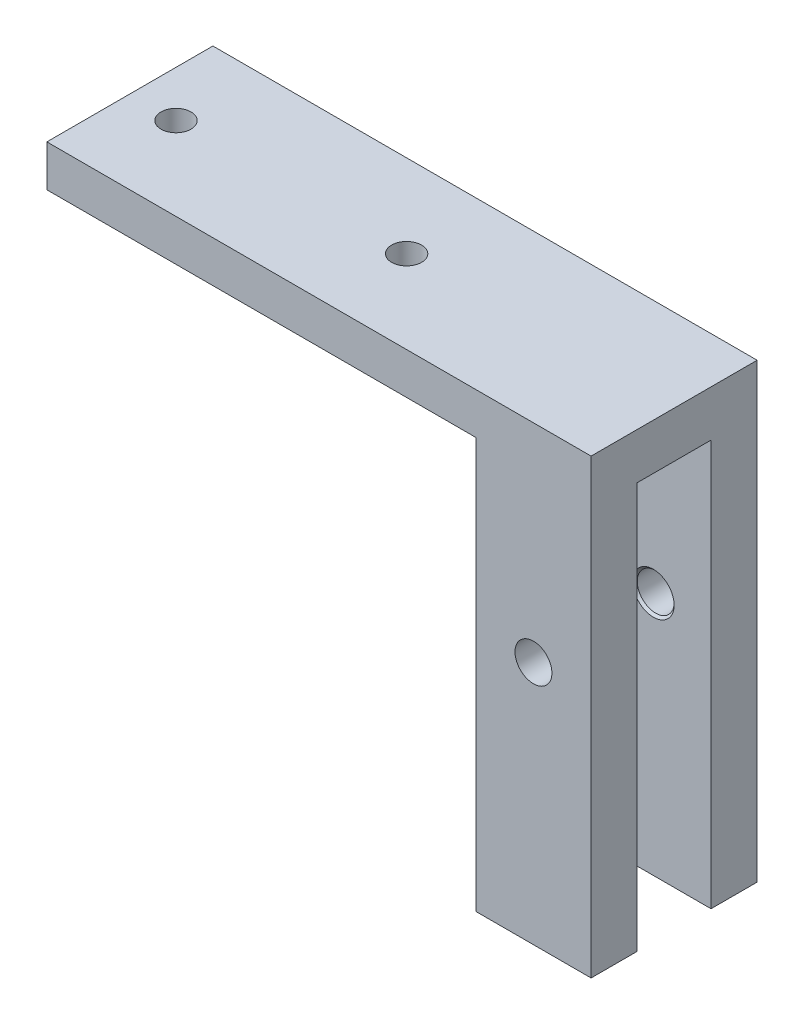
ISO-10303-21;
HEADER;
FILE_DESCRIPTION(('STEP AP214'),'2;1');
FILE_NAME('part.step','',(''),(''),'','','');
FILE_SCHEMA(('AUTOMOTIVE_DESIGN { 1 0 10303 214 1 1 1 1 }'));
ENDSEC;
DATA;
#1=APPLICATION_CONTEXT('core data for automotive mechanical design processes');
#2=APPLICATION_PROTOCOL_DEFINITION('international standard','automotive_design',2000,#1);
#3=PRODUCT_CONTEXT('',#1,'mechanical');
#4=PRODUCT('Part','Part','',(#3));
#5=PRODUCT_RELATED_PRODUCT_CATEGORY('part','',(#4));
#6=PRODUCT_DEFINITION_FORMATION('','',#4);
#7=PRODUCT_DEFINITION_CONTEXT('part definition',#1,'design');
#8=PRODUCT_DEFINITION('design','',#6,#7);
#9=PRODUCT_DEFINITION_SHAPE('','',#8);
#10=(LENGTH_UNIT() NAMED_UNIT(*) SI_UNIT(.MILLI.,.METRE.));
#11=(NAMED_UNIT(*) PLANE_ANGLE_UNIT() SI_UNIT($,.RADIAN.));
#12=(NAMED_UNIT(*) SI_UNIT($,.STERADIAN.) SOLID_ANGLE_UNIT());
#13=UNCERTAINTY_MEASURE_WITH_UNIT(LENGTH_MEASURE(1.E-05),#10,'distance_accuracy_value','');
#14=(GEOMETRIC_REPRESENTATION_CONTEXT(3) GLOBAL_UNCERTAINTY_ASSIGNED_CONTEXT((#13)) GLOBAL_UNIT_ASSIGNED_CONTEXT((#10,
#11,#12)) REPRESENTATION_CONTEXT('',''));
#15=CARTESIAN_POINT('',(0.,0.,0.));
#16=DIRECTION('',(0.,0.,1.));
#17=DIRECTION('',(1.,0.,0.));
#18=AXIS2_PLACEMENT_3D('',#15,#16,#17);
#19=CARTESIAN_POINT('',(0.,-78.,0.));
#20=DIRECTION('',(0.,-1.,0.));
#21=DIRECTION('',(0.,0.,-1.));
#22=AXIS2_PLACEMENT_3D('',#19,#20,#21);
#23=PLANE('',#22);
#24=DIRECTION('',(0.,0.,-1.));
#25=VECTOR('',#24,1.);
#26=CARTESIAN_POINT('',(30.,-78.,-7.));
#27=LINE('',#26,#25);
#28=CARTESIAN_POINT('',(30.,-78.,-5.));
#29=VERTEX_POINT('',#28);
#30=CARTESIAN_POINT('',(30.,-78.,-15.));
#31=VERTEX_POINT('',#30);
#32=EDGE_CURVE('E229',#29,#31,#27,.T.);
#33=ORIENTED_EDGE('',*,*,#32,.T.);
#34=DIRECTION('',(1.,0.,0.));
#35=VECTOR('',#34,1.);
#36=CARTESIAN_POINT('',(30.,-78.,-15.));
#37=LINE('',#36,#35);
#38=CARTESIAN_POINT('',(55.,-78.,-15.));
#39=VERTEX_POINT('',#38);
#40=EDGE_CURVE('E182',#31,#39,#37,.T.);
#41=ORIENTED_EDGE('',*,*,#40,.T.);
#42=DIRECTION('',(0.,0.,1.));
#43=VECTOR('',#42,1.);
#44=CARTESIAN_POINT('',(55.,-78.,0.));
#45=LINE('',#44,#43);
#46=CARTESIAN_POINT('',(55.,-78.,-5.));
#47=VERTEX_POINT('',#46);
#48=EDGE_CURVE('E130',#39,#47,#45,.T.);
#49=ORIENTED_EDGE('',*,*,#48,.T.);
#50=DIRECTION('',(-1.,0.,0.));
#51=VECTOR('',#50,1.);
#52=CARTESIAN_POINT('',(45.,-78.,-5.));
#53=LINE('',#52,#51);
#54=EDGE_CURVE('E113',#47,#29,#53,.T.);
#55=ORIENTED_EDGE('',*,*,#54,.T.);
#56=EDGE_LOOP('',(#33,#41,#49,#55));
#57=FACE_BOUND('',#56,.T.);
#58=ADVANCED_FACE('F18',(#57),#23,.T.);
#59=CARTESIAN_POINT('',(0.,20.,0.));
#60=DIRECTION('',(0.,-1.,0.));
#61=DIRECTION('',(0.,0.,-1.));
#62=AXIS2_PLACEMENT_3D('',#59,#60,#61);
#63=PLANE('',#62);
#64=CARTESIAN_POINT('',(-53.,20.,3.));
#65=DIRECTION('',(0.,-1.,0.));
#66=DIRECTION('',(0.,0.,-1.));
#67=AXIS2_PLACEMENT_3D('',#64,#65,#66);
#68=CIRCLE('',#67,3.25);
#69=CARTESIAN_POINT('',(-53.,20.,-0.25));
#70=VERTEX_POINT('',#69);
#71=EDGE_CURVE('E126',#70,#70,#68,.F.);
#72=ORIENTED_EDGE('',*,*,#71,.F.);
#73=EDGE_LOOP('',(#72));
#74=FACE_BOUND('',#73,.T.);
#75=CARTESIAN_POINT('',(-3.,20.,3.));
#76=DIRECTION('',(0.,-1.,0.));
#77=DIRECTION('',(0.,0.,-1.));
#78=AXIS2_PLACEMENT_3D('',#75,#76,#77);
#79=CIRCLE('',#78,3.25);
#80=CARTESIAN_POINT('',(-3.,20.,-0.25));
#81=VERTEX_POINT('',#80);
#82=EDGE_CURVE('E192',#81,#81,#79,.F.);
#83=ORIENTED_EDGE('',*,*,#82,.F.);
#84=EDGE_LOOP('',(#83));
#85=FACE_BOUND('',#84,.T.);
#86=DIRECTION('',(0.,0.,1.));
#87=VECTOR('',#86,1.);
#88=CARTESIAN_POINT('',(55.,20.,0.));
#89=LINE('',#88,#87);
#90=CARTESIAN_POINT('',(55.,20.,-15.));
#91=VERTEX_POINT('',#90);
#92=CARTESIAN_POINT('',(55.,20.,21.));
#93=VERTEX_POINT('',#92);
#94=EDGE_CURVE('E105',#91,#93,#89,.T.);
#95=ORIENTED_EDGE('',*,*,#94,.F.);
#96=DIRECTION('',(1.,0.,0.));
#97=VECTOR('',#96,1.);
#98=CARTESIAN_POINT('',(-25.,20.,-15.));
#99=LINE('',#98,#97);
#100=CARTESIAN_POINT('',(-63.,20.,-15.));
#101=VERTEX_POINT('',#100);
#102=EDGE_CURVE('E109',#101,#91,#99,.T.);
#103=ORIENTED_EDGE('',*,*,#102,.F.);
#104=DIRECTION('',(0.,0.,-1.));
#105=VECTOR('',#104,1.);
#106=CARTESIAN_POINT('',(-63.,20.,15.));
#107=LINE('',#106,#105);
#108=CARTESIAN_POINT('',(-63.,20.,21.));
#109=VERTEX_POINT('',#108);
#110=EDGE_CURVE('E162',#109,#101,#107,.T.);
#111=ORIENTED_EDGE('',*,*,#110,.F.);
#112=DIRECTION('',(-1.,0.,0.));
#113=VECTOR('',#112,1.);
#114=CARTESIAN_POINT('',(25.,20.,21.));
#115=LINE('',#114,#113);
#116=EDGE_CURVE('E111',#93,#109,#115,.T.);
#117=ORIENTED_EDGE('',*,*,#116,.F.);
#118=EDGE_LOOP('',(#95,#103,#111,#117));
#119=FACE_BOUND('',#118,.T.);
#120=ADVANCED_FACE('F107',(#74,#85,#119),#63,.F.);
#121=CARTESIAN_POINT('',(0.,10.,0.));
#122=DIRECTION('',(0.,-1.,0.));
#123=DIRECTION('',(0.,0.,-1.));
#124=AXIS2_PLACEMENT_3D('',#121,#122,#123);
#125=PLANE('',#124);
#126=CARTESIAN_POINT('',(-3.,10.,3.));
#127=DIRECTION('',(0.,1.,0.));
#128=DIRECTION('',(1.,0.,0.));
#129=AXIS2_PLACEMENT_3D('',#126,#127,#128);
#130=CIRCLE('',#129,3.25);
#131=CARTESIAN_POINT('',(0.25,10.,3.));
#132=VERTEX_POINT('',#131);
#133=EDGE_CURVE('E149',#132,#132,#130,.T.);
#134=ORIENTED_EDGE('',*,*,#133,.T.);
#135=EDGE_LOOP('',(#134));
#136=FACE_BOUND('',#135,.T.);
#137=CARTESIAN_POINT('',(-53.,10.,3.));
#138=DIRECTION('',(0.,1.,0.));
#139=DIRECTION('',(1.,0.,0.));
#140=AXIS2_PLACEMENT_3D('',#137,#138,#139);
#141=CIRCLE('',#140,3.25);
#142=CARTESIAN_POINT('',(-49.75,10.,3.));
#143=VERTEX_POINT('',#142);
#144=EDGE_CURVE('E143',#143,#143,#141,.T.);
#145=ORIENTED_EDGE('',*,*,#144,.T.);
#146=EDGE_LOOP('',(#145));
#147=FACE_BOUND('',#146,.T.);
#148=DIRECTION('',(0.,0.,-1.));
#149=VECTOR('',#148,1.);
#150=CARTESIAN_POINT('',(-62.,10.,0.));
#151=LINE('',#150,#149);
#152=CARTESIAN_POINT('',(-62.,10.,20.));
#153=VERTEX_POINT('',#152);
#154=CARTESIAN_POINT('',(-62.,10.,-14.));
#155=VERTEX_POINT('',#154);
#156=EDGE_CURVE('E164',#153,#155,#151,.T.);
#157=ORIENTED_EDGE('',*,*,#156,.T.);
#158=DIRECTION('',(1.,0.,0.));
#159=VECTOR('',#158,1.);
#160=CARTESIAN_POINT('',(0.,10.,-14.));
#161=LINE('',#160,#159);
#162=CARTESIAN_POINT('',(30.,10.,-14.));
#163=VERTEX_POINT('',#162);
#164=EDGE_CURVE('E166',#155,#163,#161,.T.);
#165=ORIENTED_EDGE('',*,*,#164,.T.);
#166=DIRECTION('',(0.,0.,1.));
#167=VECTOR('',#166,1.);
#168=CARTESIAN_POINT('',(30.,10.,-7.5));
#169=LINE('',#168,#167);
#170=CARTESIAN_POINT('',(30.,10.,-5.));
#171=VERTEX_POINT('',#170);
#172=EDGE_CURVE('E137',#163,#171,#169,.T.);
#173=ORIENTED_EDGE('',*,*,#172,.T.);
#174=DIRECTION('',(-1.,0.,0.));
#175=VECTOR('',#174,1.);
#176=CARTESIAN_POINT('',(20.,10.,-5.));
#177=LINE('',#176,#175);
#178=CARTESIAN_POINT('',(55.,10.,-5.));
#179=VERTEX_POINT('',#178);
#180=EDGE_CURVE('E155',#171,#179,#177,.F.);
#181=ORIENTED_EDGE('',*,*,#180,.T.);
#182=DIRECTION('',(0.,0.,1.));
#183=VECTOR('',#182,1.);
#184=CARTESIAN_POINT('',(55.,10.,5.));
#185=LINE('',#184,#183);
#186=CARTESIAN_POINT('',(55.,10.,11.));
#187=VERTEX_POINT('',#186);
#188=EDGE_CURVE('E151',#179,#187,#185,.T.);
#189=ORIENTED_EDGE('',*,*,#188,.T.);
#190=DIRECTION('',(1.,0.,0.));
#191=VECTOR('',#190,1.);
#192=CARTESIAN_POINT('',(30.,10.,11.));
#193=LINE('',#192,#191);
#194=CARTESIAN_POINT('',(30.,10.,11.));
#195=VERTEX_POINT('',#194);
#196=EDGE_CURVE('E114',#187,#195,#193,.F.);
#197=ORIENTED_EDGE('',*,*,#196,.T.);
#198=DIRECTION('',(0.,0.,1.));
#199=VECTOR('',#198,1.);
#200=CARTESIAN_POINT('',(30.,10.,15.));
#201=LINE('',#200,#199);
#202=CARTESIAN_POINT('',(30.,10.,20.));
#203=VERTEX_POINT('',#202);
#204=EDGE_CURVE('E139',#195,#203,#201,.T.);
#205=ORIENTED_EDGE('',*,*,#204,.T.);
#206=DIRECTION('',(1.,0.,0.));
#207=VECTOR('',#206,1.);
#208=CARTESIAN_POINT('',(0.,10.,20.));
#209=LINE('',#208,#207);
#210=EDGE_CURVE('E167',#203,#153,#209,.F.);
#211=ORIENTED_EDGE('',*,*,#210,.T.);
#212=EDGE_LOOP('',(#157,#165,#173,#181,#189,#197,#205,#211));
#213=FACE_BOUND('',#212,.T.);
#214=ADVANCED_FACE('F253',(#136,#147,#213),#125,.T.);
#215=CARTESIAN_POINT('',(30.,-30.,-7.5));
#216=DIRECTION('',(1.,0.,0.));
#217=DIRECTION('',(0.,0.,-1.));
#218=AXIS2_PLACEMENT_3D('',#215,#216,#217);
#219=PLANE('',#218);
#220=DIRECTION('',(0.,1.,0.));
#221=VECTOR('',#220,1.);
#222=CARTESIAN_POINT('',(30.,-30.,-15.));
#223=LINE('',#222,#221);
#224=CARTESIAN_POINT('',(30.,11.,-15.));
#225=VERTEX_POINT('',#224);
#226=EDGE_CURVE('E144',#31,#225,#223,.T.);
#227=ORIENTED_EDGE('',*,*,#226,.F.);
#228=ORIENTED_EDGE('',*,*,#32,.F.);
#229=DIRECTION('',(0.,1.,0.));
#230=VECTOR('',#229,1.);
#231=CARTESIAN_POINT('',(30.,-30.,-5.));
#232=LINE('',#231,#230);
#233=EDGE_CURVE('E146',#29,#171,#232,.T.);
#234=ORIENTED_EDGE('',*,*,#233,.T.);
#235=ORIENTED_EDGE('',*,*,#172,.F.);
#236=DIRECTION('',(0.,-0.707106781186547,0.707106781186548));
#237=VECTOR('',#236,1.);
#238=CARTESIAN_POINT('',(30.,-13.25,9.25));
#239=LINE('',#238,#237);
#240=EDGE_CURVE('E175',#163,#225,#239,.F.);
#241=ORIENTED_EDGE('',*,*,#240,.T.);
#242=EDGE_LOOP('',(#227,#228,#234,#235,#241));
#243=FACE_BOUND('',#242,.T.);
#244=ADVANCED_FACE('F262',(#243),#219,.F.);
#245=CARTESIAN_POINT('',(25.,10.,21.));
#246=DIRECTION('',(0.,0.,1.));
#247=DIRECTION('',(1.,0.,0.));
#248=AXIS2_PLACEMENT_3D('',#245,#246,#247);
#249=PLANE('',#248);
#250=DIRECTION('',(0.,-1.,0.));
#251=VECTOR('',#250,1.);
#252=CARTESIAN_POINT('',(-63.,10.,21.));
#253=LINE('',#252,#251);
#254=CARTESIAN_POINT('',(-63.,11.,21.));
#255=VERTEX_POINT('',#254);
#256=EDGE_CURVE('E161',#109,#255,#253,.T.);
#257=ORIENTED_EDGE('',*,*,#256,.T.);
#258=DIRECTION('',(-1.,0.,0.));
#259=VECTOR('',#258,1.);
#260=CARTESIAN_POINT('',(25.,11.,21.));
#261=LINE('',#260,#259);
#262=CARTESIAN_POINT('',(30.,11.,21.));
#263=VERTEX_POINT('',#262);
#264=EDGE_CURVE('E174',#255,#263,#261,.F.);
#265=ORIENTED_EDGE('',*,*,#264,.T.);
#266=DIRECTION('',(0.,1.,0.));
#267=VECTOR('',#266,1.);
#268=CARTESIAN_POINT('',(30.,-30.,21.));
#269=LINE('',#268,#267);
#270=CARTESIAN_POINT('',(30.,-78.,21.));
#271=VERTEX_POINT('',#270);
#272=EDGE_CURVE('E190',#271,#263,#269,.T.);
#273=ORIENTED_EDGE('',*,*,#272,.F.);
#274=DIRECTION('',(-1.,0.,0.));
#275=VECTOR('',#274,1.);
#276=CARTESIAN_POINT('',(55.,-78.,21.));
#277=LINE('',#276,#275);
#278=CARTESIAN_POINT('',(55.,-78.,21.));
#279=VERTEX_POINT('',#278);
#280=EDGE_CURVE('E225',#279,#271,#277,.T.);
#281=ORIENTED_EDGE('',*,*,#280,.F.);
#282=DIRECTION('',(0.,1.,0.));
#283=VECTOR('',#282,1.);
#284=CARTESIAN_POINT('',(55.,-6.5,21.));
#285=LINE('',#284,#283);
#286=EDGE_CURVE('E134',#279,#93,#285,.T.);
#287=ORIENTED_EDGE('',*,*,#286,.T.);
#288=ORIENTED_EDGE('',*,*,#116,.T.);
#289=EDGE_LOOP('',(#257,#265,#273,#281,#287,#288));
#290=FACE_BOUND('',#289,.T.);
#291=CARTESIAN_POINT('',(42.5,-25.,21.));
#292=DIRECTION('',(0.,0.,1.));
#293=DIRECTION('',(1.,0.,0.));
#294=AXIS2_PLACEMENT_3D('',#291,#292,#293);
#295=CIRCLE('',#294,4.);
#296=CARTESIAN_POINT('',(46.5,-25.,21.));
#297=VERTEX_POINT('',#296);
#298=EDGE_CURVE('E199',#297,#297,#295,.F.);
#299=ORIENTED_EDGE('',*,*,#298,.T.);
#300=EDGE_LOOP('',(#299));
#301=FACE_BOUND('',#300,.T.);
#302=ADVANCED_FACE('F239',(#290,#301),#249,.T.);
#303=CARTESIAN_POINT('',(30.,-30.,15.));
#304=DIRECTION('',(1.,0.,0.));
#305=DIRECTION('',(0.,0.,-1.));
#306=AXIS2_PLACEMENT_3D('',#303,#304,#305);
#307=PLANE('',#306);
#308=DIRECTION('',(0.,0.,-1.));
#309=VECTOR('',#308,1.);
#310=CARTESIAN_POINT('',(30.,-78.,15.));
#311=LINE('',#310,#309);
#312=CARTESIAN_POINT('',(30.,-78.,11.));
#313=VERTEX_POINT('',#312);
#314=EDGE_CURVE('E22',#271,#313,#311,.T.);
#315=ORIENTED_EDGE('',*,*,#314,.F.);
#316=ORIENTED_EDGE('',*,*,#272,.T.);
#317=DIRECTION('',(0.,0.707106781186547,0.707106781186548));
#318=VECTOR('',#317,1.);
#319=CARTESIAN_POINT('',(30.,-12.5,-2.5));
#320=LINE('',#319,#318);
#321=EDGE_CURVE('E178',#263,#203,#320,.F.);
#322=ORIENTED_EDGE('',*,*,#321,.T.);
#323=ORIENTED_EDGE('',*,*,#204,.F.);
#324=DIRECTION('',(0.,1.,0.));
#325=VECTOR('',#324,1.);
#326=CARTESIAN_POINT('',(30.,-30.,11.));
#327=LINE('',#326,#325);
#328=EDGE_CURVE('E145',#313,#195,#327,.T.);
#329=ORIENTED_EDGE('',*,*,#328,.F.);
#330=EDGE_LOOP('',(#315,#316,#322,#323,#329));
#331=FACE_BOUND('',#330,.T.);
#332=ADVANCED_FACE('F244',(#331),#307,.F.);
#333=CARTESIAN_POINT('',(30.,-30.,11.));
#334=DIRECTION('',(0.,0.,1.));
#335=DIRECTION('',(1.,0.,0.));
#336=AXIS2_PLACEMENT_3D('',#333,#334,#335);
#337=PLANE('',#336);
#338=CARTESIAN_POINT('',(42.5,-25.,11.));
#339=DIRECTION('',(0.,0.,1.));
#340=DIRECTION('',(1.,0.,0.));
#341=AXIS2_PLACEMENT_3D('',#338,#339,#340);
#342=CIRCLE('',#341,4.5);
#343=CARTESIAN_POINT('',(47.,-25.,11.));
#344=VERTEX_POINT('',#343);
#345=EDGE_CURVE('E11',#344,#344,#342,.T.);
#346=ORIENTED_EDGE('',*,*,#345,.T.);
#347=EDGE_LOOP('',(#346));
#348=FACE_BOUND('',#347,.T.);
#349=DIRECTION('',(0.,-1.,0.));
#350=VECTOR('',#349,1.);
#351=CARTESIAN_POINT('',(55.,-12.5,11.));
#352=LINE('',#351,#350);
#353=CARTESIAN_POINT('',(55.,-78.,11.));
#354=VERTEX_POINT('',#353);
#355=EDGE_CURVE('E189',#187,#354,#352,.T.);
#356=ORIENTED_EDGE('',*,*,#355,.T.);
#357=DIRECTION('',(1.,0.,0.));
#358=VECTOR('',#357,1.);
#359=CARTESIAN_POINT('',(30.,-78.,11.));
#360=LINE('',#359,#358);
#361=EDGE_CURVE('E132',#313,#354,#360,.T.);
#362=ORIENTED_EDGE('',*,*,#361,.F.);
#363=ORIENTED_EDGE('',*,*,#328,.T.);
#364=ORIENTED_EDGE('',*,*,#196,.F.);
#365=EDGE_LOOP('',(#356,#362,#363,#364));
#366=FACE_BOUND('',#365,.T.);
#367=ADVANCED_FACE('F248',(#348,#366),#337,.F.);
#368=CARTESIAN_POINT('',(-53.,28.4436909588346,3.));
#369=DIRECTION('',(0.,-1.,0.));
#370=DIRECTION('',(0.,0.,-1.));
#371=AXIS2_PLACEMENT_3D('',#368,#369,#370);
#372=CYLINDRICAL_SURFACE('',#371,3.25);
#373=ORIENTED_EDGE('',*,*,#71,.T.);
#374=EDGE_LOOP('',(#373));
#375=FACE_BOUND('',#374,.T.);
#376=ORIENTED_EDGE('',*,*,#144,.F.);
#377=EDGE_LOOP('',(#376));
#378=FACE_BOUND('',#377,.T.);
#379=ADVANCED_FACE('F323',(#375,#378),#372,.F.);
#380=CARTESIAN_POINT('',(-3.,28.4436909588346,3.));
#381=DIRECTION('',(0.,-1.,0.));
#382=DIRECTION('',(0.,0.,-1.));
#383=AXIS2_PLACEMENT_3D('',#380,#381,#382);
#384=CYLINDRICAL_SURFACE('',#383,3.25);
#385=ORIENTED_EDGE('',*,*,#82,.T.);
#386=EDGE_LOOP('',(#385));
#387=FACE_BOUND('',#386,.T.);
#388=ORIENTED_EDGE('',*,*,#133,.F.);
#389=EDGE_LOOP('',(#388));
#390=FACE_BOUND('',#389,.T.);
#391=ADVANCED_FACE('F325',(#387,#390),#384,.F.);
#392=CARTESIAN_POINT('',(-25.,10.,-15.));
#393=DIRECTION('',(0.,0.,-1.));
#394=DIRECTION('',(-1.,0.,0.));
#395=AXIS2_PLACEMENT_3D('',#392,#393,#394);
#396=PLANE('',#395);
#397=ORIENTED_EDGE('',*,*,#226,.T.);
#398=DIRECTION('',(-1.,0.,0.));
#399=VECTOR('',#398,1.);
#400=CARTESIAN_POINT('',(-25.,11.,-15.));
#401=LINE('',#400,#399);
#402=CARTESIAN_POINT('',(-63.,11.,-15.));
#403=VERTEX_POINT('',#402);
#404=EDGE_CURVE('E170',#225,#403,#401,.T.);
#405=ORIENTED_EDGE('',*,*,#404,.T.);
#406=DIRECTION('',(0.,-1.,0.));
#407=VECTOR('',#406,1.);
#408=CARTESIAN_POINT('',(-63.,10.,-15.));
#409=LINE('',#408,#407);
#410=EDGE_CURVE('E124',#101,#403,#409,.T.);
#411=ORIENTED_EDGE('',*,*,#410,.F.);
#412=ORIENTED_EDGE('',*,*,#102,.T.);
#413=DIRECTION('',(0.,-1.,0.));
#414=VECTOR('',#413,1.);
#415=CARTESIAN_POINT('',(55.,-6.5,-15.));
#416=LINE('',#415,#414);
#417=EDGE_CURVE('E121',#91,#39,#416,.T.);
#418=ORIENTED_EDGE('',*,*,#417,.T.);
#419=ORIENTED_EDGE('',*,*,#40,.F.);
#420=EDGE_LOOP('',(#397,#405,#411,#412,#418,#419));
#421=FACE_BOUND('',#420,.T.);
#422=CARTESIAN_POINT('',(42.5,-25.,-15.));
#423=DIRECTION('',(0.,0.,-1.));
#424=DIRECTION('',(-1.,0.,0.));
#425=AXIS2_PLACEMENT_3D('',#422,#423,#424);
#426=CIRCLE('',#425,4.);
#427=CARTESIAN_POINT('',(38.5,-25.,-15.));
#428=VERTEX_POINT('',#427);
#429=EDGE_CURVE('E140',#428,#428,#426,.F.);
#430=ORIENTED_EDGE('',*,*,#429,.T.);
#431=EDGE_LOOP('',(#430));
#432=FACE_BOUND('',#431,.T.);
#433=ADVANCED_FACE('F118',(#421,#432),#396,.T.);
#434=CARTESIAN_POINT('',(-63.,10.,15.));
#435=DIRECTION('',(-1.,0.,0.));
#436=DIRECTION('',(0.,0.,1.));
#437=AXIS2_PLACEMENT_3D('',#434,#435,#436);
#438=PLANE('',#437);
#439=ORIENTED_EDGE('',*,*,#410,.T.);
#440=DIRECTION('',(0.,0.,1.));
#441=VECTOR('',#440,1.);
#442=CARTESIAN_POINT('',(-63.,11.,15.));
#443=LINE('',#442,#441);
#444=EDGE_CURVE('E172',#403,#255,#443,.T.);
#445=ORIENTED_EDGE('',*,*,#444,.T.);
#446=ORIENTED_EDGE('',*,*,#256,.F.);
#447=ORIENTED_EDGE('',*,*,#110,.T.);
#448=EDGE_LOOP('',(#439,#445,#446,#447));
#449=FACE_BOUND('',#448,.T.);
#450=ADVANCED_FACE('F275',(#449),#438,.T.);
#451=CARTESIAN_POINT('',(45.,-30.,-5.));
#452=DIRECTION('',(0.,0.,-1.));
#453=DIRECTION('',(-1.,0.,0.));
#454=AXIS2_PLACEMENT_3D('',#451,#452,#453);
#455=PLANE('',#454);
#456=CARTESIAN_POINT('',(42.5,-25.,-5.));
#457=DIRECTION('',(0.,0.,-1.));
#458=DIRECTION('',(-1.,0.,0.));
#459=AXIS2_PLACEMENT_3D('',#456,#457,#458);
#460=CIRCLE('',#459,4.5);
#461=CARTESIAN_POINT('',(38.,-25.,-5.));
#462=VERTEX_POINT('',#461);
#463=EDGE_CURVE('E215',#462,#462,#460,.T.);
#464=ORIENTED_EDGE('',*,*,#463,.T.);
#465=EDGE_LOOP('',(#464));
#466=FACE_BOUND('',#465,.T.);
#467=ORIENTED_EDGE('',*,*,#54,.F.);
#468=DIRECTION('',(0.,1.,0.));
#469=VECTOR('',#468,1.);
#470=CARTESIAN_POINT('',(55.,-35.,-5.));
#471=LINE('',#470,#469);
#472=EDGE_CURVE('E131',#47,#179,#471,.T.);
#473=ORIENTED_EDGE('',*,*,#472,.T.);
#474=ORIENTED_EDGE('',*,*,#180,.F.);
#475=ORIENTED_EDGE('',*,*,#233,.F.);
#476=EDGE_LOOP('',(#467,#473,#474,#475));
#477=FACE_BOUND('',#476,.T.);
#478=ADVANCED_FACE('F258',(#466,#477),#455,.F.);
#479=CARTESIAN_POINT('',(42.5,-25.,-28.0515819278363));
#480=DIRECTION('',(0.,0.,1.));
#481=DIRECTION('',(1.,0.,0.));
#482=AXIS2_PLACEMENT_3D('',#479,#480,#481);
#483=CYLINDRICAL_SURFACE('',#482,4.);
#484=CARTESIAN_POINT('',(42.5,-25.,-5.5));
#485=DIRECTION('',(0.,0.,1.));
#486=DIRECTION('',(1.,0.,0.));
#487=AXIS2_PLACEMENT_3D('',#484,#485,#486);
#488=CIRCLE('',#487,4.);
#489=CARTESIAN_POINT('',(46.5,-25.,-5.5));
#490=VERTEX_POINT('',#489);
#491=EDGE_CURVE('E212',#490,#490,#488,.T.);
#492=ORIENTED_EDGE('',*,*,#491,.T.);
#493=EDGE_LOOP('',(#492));
#494=FACE_BOUND('',#493,.T.);
#495=ORIENTED_EDGE('',*,*,#429,.F.);
#496=EDGE_LOOP('',(#495));
#497=FACE_BOUND('',#496,.T.);
#498=ADVANCED_FACE('F315',(#494,#497),#483,.F.);
#499=CARTESIAN_POINT('',(42.5,-25.,-28.0515819278363));
#500=DIRECTION('',(0.,0.,1.));
#501=DIRECTION('',(1.,0.,0.));
#502=AXIS2_PLACEMENT_3D('',#499,#500,#501);
#503=CYLINDRICAL_SURFACE('',#502,4.);
#504=CARTESIAN_POINT('',(42.5,-25.,11.5));
#505=DIRECTION('',(0.,0.,-1.));
#506=DIRECTION('',(-1.,0.,0.));
#507=AXIS2_PLACEMENT_3D('',#504,#505,#506);
#508=CIRCLE('',#507,4.);
#509=CARTESIAN_POINT('',(38.5,-25.,11.5));
#510=VERTEX_POINT('',#509);
#511=EDGE_CURVE('E28',#510,#510,#508,.T.);
#512=ORIENTED_EDGE('',*,*,#511,.T.);
#513=EDGE_LOOP('',(#512));
#514=FACE_BOUND('',#513,.T.);
#515=ORIENTED_EDGE('',*,*,#298,.F.);
#516=EDGE_LOOP('',(#515));
#517=FACE_BOUND('',#516,.T.);
#518=ADVANCED_FACE('F312',(#514,#517),#503,.F.);
#519=CARTESIAN_POINT('',(55.,0.,0.));
#520=DIRECTION('',(-1.,0.,0.));
#521=DIRECTION('',(0.,0.,1.));
#522=AXIS2_PLACEMENT_3D('',#519,#520,#521);
#523=PLANE('',#522);
#524=ORIENTED_EDGE('',*,*,#48,.F.);
#525=ORIENTED_EDGE('',*,*,#417,.F.);
#526=ORIENTED_EDGE('',*,*,#94,.T.);
#527=ORIENTED_EDGE('',*,*,#286,.F.);
#528=DIRECTION('',(0.,0.,1.));
#529=VECTOR('',#528,1.);
#530=CARTESIAN_POINT('',(55.,-78.,0.));
#531=LINE('',#530,#529);
#532=EDGE_CURVE('E36',#354,#279,#531,.T.);
#533=ORIENTED_EDGE('',*,*,#532,.F.);
#534=ORIENTED_EDGE('',*,*,#355,.F.);
#535=ORIENTED_EDGE('',*,*,#188,.F.);
#536=ORIENTED_EDGE('',*,*,#472,.F.);
#537=EDGE_LOOP('',(#524,#525,#526,#527,#533,#534,#535,#536));
#538=FACE_BOUND('',#537,.T.);
#539=ADVANCED_FACE('F128',(#538),#523,.F.);
#540=CARTESIAN_POINT('',(0.,-78.,0.));
#541=DIRECTION('',(0.,-1.,0.));
#542=DIRECTION('',(0.,0.,-1.));
#543=AXIS2_PLACEMENT_3D('',#540,#541,#542);
#544=PLANE('',#543);
#545=ORIENTED_EDGE('',*,*,#532,.T.);
#546=ORIENTED_EDGE('',*,*,#280,.T.);
#547=ORIENTED_EDGE('',*,*,#314,.T.);
#548=ORIENTED_EDGE('',*,*,#361,.T.);
#549=EDGE_LOOP('',(#545,#546,#547,#548));
#550=FACE_BOUND('',#549,.T.);
#551=ADVANCED_FACE('F20',(#550),#544,.T.);
#552=CARTESIAN_POINT('',(0.,10.,20.));
#553=DIRECTION('',(0.,0.707106781186548,-0.707106781186547));
#554=DIRECTION('',(0.,0.707106781186547,0.707106781186548));
#555=AXIS2_PLACEMENT_3D('',#552,#553,#554);
#556=PLANE('',#555);
#557=ORIENTED_EDGE('',*,*,#321,.F.);
#558=ORIENTED_EDGE('',*,*,#264,.F.);
#559=DIRECTION('',(-0.577350269189626,0.577350269189625,0.577350269189626));
#560=VECTOR('',#559,1.);
#561=CARTESIAN_POINT('',(-55.3333333333333,3.33333333333334,13.3333333333333));
#562=LINE('',#561,#560);
#563=EDGE_CURVE('E159',#153,#255,#562,.T.);
#564=ORIENTED_EDGE('',*,*,#563,.F.);
#565=ORIENTED_EDGE('',*,*,#210,.F.);
#566=EDGE_LOOP('',(#557,#558,#564,#565));
#567=FACE_BOUND('',#566,.T.);
#568=ADVANCED_FACE('F277',(#567),#556,.F.);
#569=CARTESIAN_POINT('',(-62.,10.,0.));
#570=DIRECTION('',(0.707106781186547,0.707106781186548,0.));
#571=DIRECTION('',(0.,0.,-1.));
#572=AXIS2_PLACEMENT_3D('',#569,#570,#571);
#573=PLANE('',#572);
#574=ORIENTED_EDGE('',*,*,#563,.T.);
#575=ORIENTED_EDGE('',*,*,#444,.F.);
#576=DIRECTION('',(0.577350269189626,-0.577350269189625,0.577350269189626));
#577=VECTOR('',#576,1.);
#578=CARTESIAN_POINT('',(-57.3333333333333,5.33333333333334,-9.33333333333333));
#579=LINE('',#578,#577);
#580=EDGE_CURVE('E179',#155,#403,#579,.F.);
#581=ORIENTED_EDGE('',*,*,#580,.F.);
#582=ORIENTED_EDGE('',*,*,#156,.F.);
#583=EDGE_LOOP('',(#574,#575,#581,#582));
#584=FACE_BOUND('',#583,.T.);
#585=ADVANCED_FACE('F272',(#584),#573,.F.);
#586=CARTESIAN_POINT('',(0.,10.,-14.));
#587=DIRECTION('',(0.,0.707106781186548,0.707106781186547));
#588=DIRECTION('',(1.,0.,0.));
#589=AXIS2_PLACEMENT_3D('',#586,#587,#588);
#590=PLANE('',#589);
#591=ORIENTED_EDGE('',*,*,#580,.T.);
#592=ORIENTED_EDGE('',*,*,#404,.F.);
#593=ORIENTED_EDGE('',*,*,#240,.F.);
#594=ORIENTED_EDGE('',*,*,#164,.F.);
#595=EDGE_LOOP('',(#591,#592,#593,#594));
#596=FACE_BOUND('',#595,.T.);
#597=ADVANCED_FACE('F267',(#596),#590,.F.);
#598=CARTESIAN_POINT('',(42.5,-25.,-5.5));
#599=DIRECTION('',(0.,0.,1.));
#600=DIRECTION('',(1.,0.,0.));
#601=AXIS2_PLACEMENT_3D('',#598,#599,#600);
#602=CONICAL_SURFACE('',#601,4.,0.785398163397446);
#603=ORIENTED_EDGE('',*,*,#463,.F.);
#604=EDGE_LOOP('',(#603));
#605=FACE_BOUND('',#604,.T.);
#606=ORIENTED_EDGE('',*,*,#491,.F.);
#607=EDGE_LOOP('',(#606));
#608=FACE_BOUND('',#607,.T.);
#609=ADVANCED_FACE('F305',(#605,#608),#602,.F.);
#610=CARTESIAN_POINT('',(42.5,-25.,11.5));
#611=DIRECTION('',(0.,0.,-1.));
#612=DIRECTION('',(-1.,0.,0.));
#613=AXIS2_PLACEMENT_3D('',#610,#611,#612);
#614=CONICAL_SURFACE('',#613,4.,0.785398163397446);
#615=ORIENTED_EDGE('',*,*,#345,.F.);
#616=EDGE_LOOP('',(#615));
#617=FACE_BOUND('',#616,.T.);
#618=ORIENTED_EDGE('',*,*,#511,.F.);
#619=EDGE_LOOP('',(#618));
#620=FACE_BOUND('',#619,.T.);
#621=ADVANCED_FACE('F298',(#617,#620),#614,.F.);
#622=CLOSED_SHELL('',(#58,#120,#214,#244,#302,#332,#367,#379,#391,#433,#450,#478,#498,#518,#539,
#551,#568,#585,#597,#609,#621));
#623=MANIFOLD_SOLID_BREP('B1',#622);
#624=ADVANCED_BREP_SHAPE_REPRESENTATION('',(#18,#623),#14);
#625=SHAPE_DEFINITION_REPRESENTATION(#9,#624);
ENDSEC;
END-ISO-10303-21;
